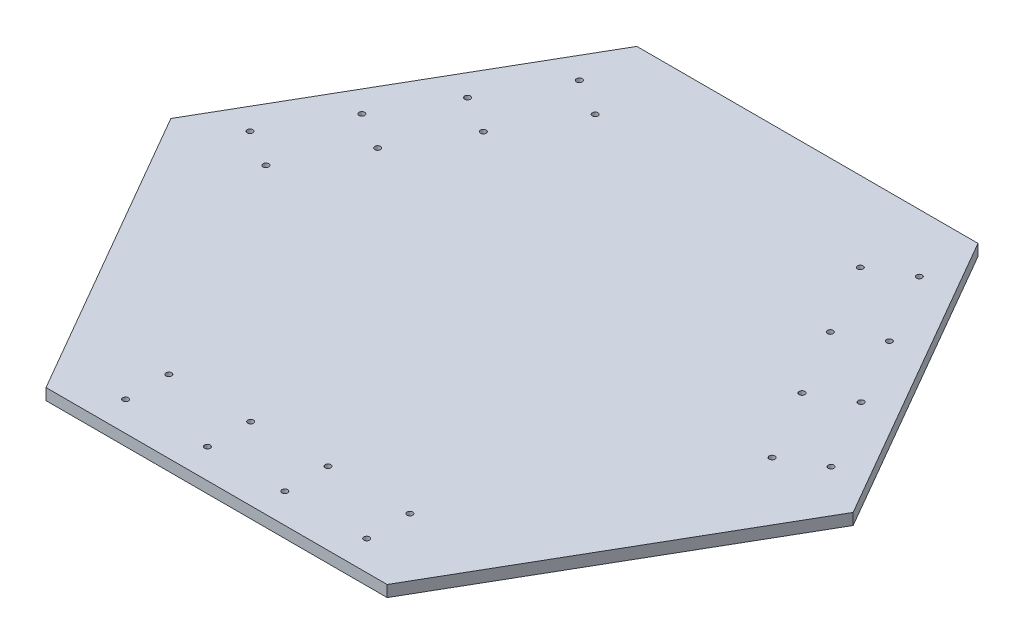
ISO-10303-21;
HEADER;
FILE_DESCRIPTION(('STEP AP214'),'2;1');
FILE_NAME('part.step','',(''),(''),'','','');
FILE_SCHEMA(('AUTOMOTIVE_DESIGN { 1 0 10303 214 1 1 1 1 }'));
ENDSEC;
DATA;
#1=APPLICATION_CONTEXT('core data for automotive mechanical design processes');
#2=APPLICATION_PROTOCOL_DEFINITION('international standard','automotive_design',2000,#1);
#3=PRODUCT_CONTEXT('',#1,'mechanical');
#4=PRODUCT('Part','Part','',(#3));
#5=PRODUCT_RELATED_PRODUCT_CATEGORY('part','',(#4));
#6=PRODUCT_DEFINITION_FORMATION('','',#4);
#7=PRODUCT_DEFINITION_CONTEXT('part definition',#1,'design');
#8=PRODUCT_DEFINITION('design','',#6,#7);
#9=PRODUCT_DEFINITION_SHAPE('','',#8);
#10=(LENGTH_UNIT() NAMED_UNIT(*) SI_UNIT(.MILLI.,.METRE.));
#11=(NAMED_UNIT(*) PLANE_ANGLE_UNIT() SI_UNIT($,.RADIAN.));
#12=(NAMED_UNIT(*) SI_UNIT($,.STERADIAN.) SOLID_ANGLE_UNIT());
#13=UNCERTAINTY_MEASURE_WITH_UNIT(LENGTH_MEASURE(1.E-05),#10,'distance_accuracy_value','');
#14=(GEOMETRIC_REPRESENTATION_CONTEXT(3) GLOBAL_UNCERTAINTY_ASSIGNED_CONTEXT((#13)) GLOBAL_UNIT_ASSIGNED_CONTEXT((#10,
#11,#12)) REPRESENTATION_CONTEXT('',''));
#15=CARTESIAN_POINT('',(0.,0.,0.));
#16=DIRECTION('',(0.,0.,1.));
#17=DIRECTION('',(1.,0.,0.));
#18=AXIS2_PLACEMENT_3D('',#15,#16,#17);
#19=CARTESIAN_POINT('',(-75.,5.,-129.903810567666));
#20=DIRECTION('',(0.866025403784439,0.,0.5));
#21=DIRECTION('',(0.5,0.,-0.866025403784439));
#22=AXIS2_PLACEMENT_3D('',#19,#20,#21);
#23=PLANE('',#22);
#24=DIRECTION('',(-0.5,0.,0.866025403784439));
#25=VECTOR('',#24,1.);
#26=CARTESIAN_POINT('',(-75.,0.,-129.903810567666));
#27=LINE('',#26,#25);
#28=CARTESIAN_POINT('',(-75.,0.,-129.903810567666));
#29=VERTEX_POINT('',#28);
#30=CARTESIAN_POINT('',(-150.,0.,0.));
#31=VERTEX_POINT('',#30);
#32=EDGE_CURVE('E127',#29,#31,#27,.T.);
#33=ORIENTED_EDGE('',*,*,#32,.T.);
#34=DIRECTION('',(0.,-1.,0.));
#35=VECTOR('',#34,1.);
#36=CARTESIAN_POINT('',(-150.,5.,0.));
#37=LINE('',#36,#35);
#38=CARTESIAN_POINT('',(-150.,5.,0.));
#39=VERTEX_POINT('',#38);
#40=EDGE_CURVE('E11',#39,#31,#37,.T.);
#41=ORIENTED_EDGE('',*,*,#40,.F.);
#42=DIRECTION('',(-0.5,0.,0.866025403784439));
#43=VECTOR('',#42,1.);
#44=CARTESIAN_POINT('',(-75.,5.,-129.903810567666));
#45=LINE('',#44,#43);
#46=CARTESIAN_POINT('',(-75.,5.,-129.903810567666));
#47=VERTEX_POINT('',#46);
#48=EDGE_CURVE('E138',#47,#39,#45,.T.);
#49=ORIENTED_EDGE('',*,*,#48,.F.);
#50=DIRECTION('',(0.,-1.,0.));
#51=VECTOR('',#50,1.);
#52=CARTESIAN_POINT('',(-75.,5.,-129.903810567666));
#53=LINE('',#52,#51);
#54=EDGE_CURVE('E123',#47,#29,#53,.T.);
#55=ORIENTED_EDGE('',*,*,#54,.T.);
#56=EDGE_LOOP('',(#33,#41,#49,#55));
#57=FACE_BOUND('',#56,.T.);
#58=ADVANCED_FACE('F43',(#57),#23,.F.);
#59=CARTESIAN_POINT('',(-150.,5.,0.));
#60=DIRECTION('',(0.866025403784439,0.,-0.5));
#61=DIRECTION('',(-0.5,0.,-0.866025403784439));
#62=AXIS2_PLACEMENT_3D('',#59,#60,#61);
#63=PLANE('',#62);
#64=DIRECTION('',(0.5,0.,0.866025403784438));
#65=VECTOR('',#64,1.);
#66=CARTESIAN_POINT('',(-150.,0.,0.));
#67=LINE('',#66,#65);
#68=CARTESIAN_POINT('',(-74.9999999999999,0.,129.903810567666));
#69=VERTEX_POINT('',#68);
#70=EDGE_CURVE('E130',#31,#69,#67,.T.);
#71=ORIENTED_EDGE('',*,*,#70,.T.);
#72=DIRECTION('',(0.,-1.,0.));
#73=VECTOR('',#72,1.);
#74=CARTESIAN_POINT('',(-74.9999999999999,5.,129.903810567666));
#75=LINE('',#74,#73);
#76=CARTESIAN_POINT('',(-74.9999999999999,5.,129.903810567666));
#77=VERTEX_POINT('',#76);
#78=EDGE_CURVE('E51',#77,#69,#75,.T.);
#79=ORIENTED_EDGE('',*,*,#78,.F.);
#80=DIRECTION('',(0.5,0.,0.866025403784438));
#81=VECTOR('',#80,1.);
#82=CARTESIAN_POINT('',(-150.,5.,0.));
#83=LINE('',#82,#81);
#84=EDGE_CURVE('E96',#39,#77,#83,.T.);
#85=ORIENTED_EDGE('',*,*,#84,.F.);
#86=ORIENTED_EDGE('',*,*,#40,.T.);
#87=EDGE_LOOP('',(#71,#79,#85,#86));
#88=FACE_BOUND('',#87,.T.);
#89=ADVANCED_FACE('F163',(#88),#63,.F.);
#90=CARTESIAN_POINT('',(-74.9999999999999,5.,129.903810567666));
#91=DIRECTION('',(0.,0.,-1.));
#92=DIRECTION('',(-1.,0.,0.));
#93=AXIS2_PLACEMENT_3D('',#90,#91,#92);
#94=PLANE('',#93);
#95=DIRECTION('',(1.,0.,0.));
#96=VECTOR('',#95,1.);
#97=CARTESIAN_POINT('',(-74.9999999999999,0.,129.903810567666));
#98=LINE('',#97,#96);
#99=CARTESIAN_POINT('',(75.,0.,129.903810567666));
#100=VERTEX_POINT('',#99);
#101=EDGE_CURVE('E133',#69,#100,#98,.T.);
#102=ORIENTED_EDGE('',*,*,#101,.T.);
#103=DIRECTION('',(0.,-1.,0.));
#104=VECTOR('',#103,1.);
#105=CARTESIAN_POINT('',(75.,5.,129.903810567666));
#106=LINE('',#105,#104);
#107=CARTESIAN_POINT('',(75.,5.,129.903810567666));
#108=VERTEX_POINT('',#107);
#109=EDGE_CURVE('E118',#108,#100,#106,.T.);
#110=ORIENTED_EDGE('',*,*,#109,.F.);
#111=DIRECTION('',(1.,0.,0.));
#112=VECTOR('',#111,1.);
#113=CARTESIAN_POINT('',(-74.9999999999999,5.,129.903810567666));
#114=LINE('',#113,#112);
#115=EDGE_CURVE('E109',#77,#108,#114,.T.);
#116=ORIENTED_EDGE('',*,*,#115,.F.);
#117=ORIENTED_EDGE('',*,*,#78,.T.);
#118=EDGE_LOOP('',(#102,#110,#116,#117));
#119=FACE_BOUND('',#118,.T.);
#120=ADVANCED_FACE('F144',(#119),#94,.F.);
#121=CARTESIAN_POINT('',(75.,5.,129.903810567666));
#122=DIRECTION('',(-0.866025403784439,0.,-0.5));
#123=DIRECTION('',(-0.5,0.,0.866025403784439));
#124=AXIS2_PLACEMENT_3D('',#121,#122,#123);
#125=PLANE('',#124);
#126=DIRECTION('',(0.5,0.,-0.866025403784439));
#127=VECTOR('',#126,1.);
#128=CARTESIAN_POINT('',(75.,0.,129.903810567666));
#129=LINE('',#128,#127);
#130=CARTESIAN_POINT('',(150.,0.,0.));
#131=VERTEX_POINT('',#130);
#132=EDGE_CURVE('E117',#100,#131,#129,.T.);
#133=ORIENTED_EDGE('',*,*,#132,.T.);
#134=DIRECTION('',(0.,-1.,0.));
#135=VECTOR('',#134,1.);
#136=CARTESIAN_POINT('',(150.,5.,0.));
#137=LINE('',#136,#135);
#138=CARTESIAN_POINT('',(150.,5.,0.));
#139=VERTEX_POINT('',#138);
#140=EDGE_CURVE('E114',#139,#131,#137,.T.);
#141=ORIENTED_EDGE('',*,*,#140,.F.);
#142=DIRECTION('',(0.5,0.,-0.866025403784439));
#143=VECTOR('',#142,1.);
#144=CARTESIAN_POINT('',(75.,5.,129.903810567666));
#145=LINE('',#144,#143);
#146=EDGE_CURVE('E103',#108,#139,#145,.T.);
#147=ORIENTED_EDGE('',*,*,#146,.F.);
#148=ORIENTED_EDGE('',*,*,#109,.T.);
#149=EDGE_LOOP('',(#133,#141,#147,#148));
#150=FACE_BOUND('',#149,.T.);
#151=ADVANCED_FACE('F115',(#150),#125,.F.);
#152=CARTESIAN_POINT('',(150.,5.,0.));
#153=DIRECTION('',(-0.866025403784439,0.,0.5));
#154=DIRECTION('',(0.5,0.,0.866025403784439));
#155=AXIS2_PLACEMENT_3D('',#152,#153,#154);
#156=PLANE('',#155);
#157=DIRECTION('',(-0.5,0.,-0.866025403784439));
#158=VECTOR('',#157,1.);
#159=CARTESIAN_POINT('',(150.,0.,0.));
#160=LINE('',#159,#158);
#161=CARTESIAN_POINT('',(75.,0.,-129.903810567666));
#162=VERTEX_POINT('',#161);
#163=EDGE_CURVE('E82',#131,#162,#160,.T.);
#164=ORIENTED_EDGE('',*,*,#163,.T.);
#165=DIRECTION('',(0.,-1.,0.));
#166=VECTOR('',#165,1.);
#167=CARTESIAN_POINT('',(75.,5.,-129.903810567666));
#168=LINE('',#167,#166);
#169=CARTESIAN_POINT('',(75.,5.,-129.903810567666));
#170=VERTEX_POINT('',#169);
#171=EDGE_CURVE('E119',#170,#162,#168,.T.);
#172=ORIENTED_EDGE('',*,*,#171,.F.);
#173=DIRECTION('',(-0.5,0.,-0.866025403784439));
#174=VECTOR('',#173,1.);
#175=CARTESIAN_POINT('',(150.,5.,0.));
#176=LINE('',#175,#174);
#177=EDGE_CURVE('E107',#139,#170,#176,.T.);
#178=ORIENTED_EDGE('',*,*,#177,.F.);
#179=ORIENTED_EDGE('',*,*,#140,.T.);
#180=EDGE_LOOP('',(#164,#172,#178,#179));
#181=FACE_BOUND('',#180,.T.);
#182=ADVANCED_FACE('F121',(#181),#156,.F.);
#183=CARTESIAN_POINT('',(75.,5.,-129.903810567666));
#184=DIRECTION('',(0.,0.,1.));
#185=DIRECTION('',(1.,0.,0.));
#186=AXIS2_PLACEMENT_3D('',#183,#184,#185);
#187=PLANE('',#186);
#188=DIRECTION('',(-1.,0.,0.));
#189=VECTOR('',#188,1.);
#190=CARTESIAN_POINT('',(75.,0.,-129.903810567666));
#191=LINE('',#190,#189);
#192=EDGE_CURVE('E88',#162,#29,#191,.T.);
#193=ORIENTED_EDGE('',*,*,#192,.T.);
#194=ORIENTED_EDGE('',*,*,#54,.F.);
#195=DIRECTION('',(-1.,0.,0.));
#196=VECTOR('',#195,1.);
#197=CARTESIAN_POINT('',(75.,5.,-129.903810567666));
#198=LINE('',#197,#196);
#199=EDGE_CURVE('E59',#170,#47,#198,.T.);
#200=ORIENTED_EDGE('',*,*,#199,.F.);
#201=ORIENTED_EDGE('',*,*,#171,.T.);
#202=EDGE_LOOP('',(#193,#194,#200,#201));
#203=FACE_BOUND('',#202,.T.);
#204=ADVANCED_FACE('F151',(#203),#187,.F.);
#205=CARTESIAN_POINT('',(0.,5.,0.));
#206=DIRECTION('',(0.,1.,0.));
#207=DIRECTION('',(0.,0.,1.));
#208=AXIS2_PLACEMENT_3D('',#205,#206,#207);
#209=PLANE('',#208);
#210=CARTESIAN_POINT('',(58.2871870788989,5.,-94.8512516844076));
#211=DIRECTION('',(0.,1.,0.));
#212=DIRECTION('',(0.,0.,1.));
#213=AXIS2_PLACEMENT_3D('',#210,#211,#212);
#214=CIRCLE('',#213,1.24999999999999);
#215=CARTESIAN_POINT('',(58.2871870788989,5.,-93.6012516844076));
#216=VERTEX_POINT('',#215);
#217=EDGE_CURVE('E723',#216,#216,#214,.T.);
#218=ORIENTED_EDGE('',*,*,#217,.F.);
#219=EDGE_LOOP('',(#218));
#220=FACE_BOUND('',#219,.T.);
#221=CARTESIAN_POINT('',(76.2871870788986,5.,-63.6743371481676));
#222=DIRECTION('',(0.,1.,0.));
#223=DIRECTION('',(0.,0.,1.));
#224=AXIS2_PLACEMENT_3D('',#221,#222,#223);
#225=CIRCLE('',#224,1.24999999999999);
#226=CARTESIAN_POINT('',(76.2871870788986,5.,-62.4243371481676));
#227=VERTEX_POINT('',#226);
#228=EDGE_CURVE('E725',#227,#227,#225,.T.);
#229=ORIENTED_EDGE('',*,*,#228,.F.);
#230=EDGE_LOOP('',(#229));
#231=FACE_BOUND('',#230,.T.);
#232=CARTESIAN_POINT('',(92.741669750803,5.,-73.1743371481675));
#233=DIRECTION('',(0.,1.,0.));
#234=DIRECTION('',(0.,0.,1.));
#235=AXIS2_PLACEMENT_3D('',#232,#233,#234);
#236=CIRCLE('',#235,1.24999999999999);
#237=CARTESIAN_POINT('',(92.741669750803,5.,-71.9243371481675));
#238=VERTEX_POINT('',#237);
#239=EDGE_CURVE('E733',#238,#238,#236,.T.);
#240=ORIENTED_EDGE('',*,*,#239,.F.);
#241=EDGE_LOOP('',(#240));
#242=FACE_BOUND('',#241,.T.);
#243=CARTESIAN_POINT('',(74.7416697508033,5.,-104.351251684407));
#244=DIRECTION('',(0.,1.,0.));
#245=DIRECTION('',(0.,0.,1.));
#246=AXIS2_PLACEMENT_3D('',#243,#244,#245);
#247=CIRCLE('',#246,1.24999999999999);
#248=CARTESIAN_POINT('',(74.7416697508033,5.,-103.101251684407));
#249=VERTEX_POINT('',#248);
#250=EDGE_CURVE('E739',#249,#249,#247,.T.);
#251=ORIENTED_EDGE('',*,*,#250,.F.);
#252=EDGE_LOOP('',(#251));
#253=FACE_BOUND('',#252,.T.);
#254=CARTESIAN_POINT('',(-111.287187078898,5.,-3.05255888325824));
#255=DIRECTION('',(0.,1.,0.));
#256=DIRECTION('',(0.,0.,1.));
#257=AXIS2_PLACEMENT_3D('',#254,#255,#256);
#258=CIRCLE('',#257,1.24999999999999);
#259=CARTESIAN_POINT('',(-111.287187078898,5.,-1.80255888325825));
#260=VERTEX_POINT('',#259);
#261=EDGE_CURVE('E745',#260,#260,#258,.T.);
#262=ORIENTED_EDGE('',*,*,#261,.F.);
#263=EDGE_LOOP('',(#262));
#264=FACE_BOUND('',#263,.T.);
#265=CARTESIAN_POINT('',(-93.2871870788978,5.,-34.229473419498));
#266=DIRECTION('',(0.,1.,0.));
#267=DIRECTION('',(0.,0.,1.));
#268=AXIS2_PLACEMENT_3D('',#265,#266,#267);
#269=CIRCLE('',#268,1.24999999999999);
#270=CARTESIAN_POINT('',(-93.2871870788978,5.,-32.979473419498));
#271=VERTEX_POINT('',#270);
#272=EDGE_CURVE('E751',#271,#271,#269,.T.);
#273=ORIENTED_EDGE('',*,*,#272,.F.);
#274=EDGE_LOOP('',(#273));
#275=FACE_BOUND('',#274,.T.);
#276=CARTESIAN_POINT('',(-109.741669750802,5.,-43.729473419498));
#277=DIRECTION('',(0.,1.,0.));
#278=DIRECTION('',(0.,0.,1.));
#279=AXIS2_PLACEMENT_3D('',#276,#277,#278);
#280=CIRCLE('',#279,1.24999999999999);
#281=CARTESIAN_POINT('',(-109.741669750802,5.,-42.479473419498));
#282=VERTEX_POINT('',#281);
#283=EDGE_CURVE('E757',#282,#282,#280,.T.);
#284=ORIENTED_EDGE('',*,*,#283,.F.);
#285=EDGE_LOOP('',(#284));
#286=FACE_BOUND('',#285,.T.);
#287=CARTESIAN_POINT('',(-127.741669750802,5.,-12.5525588832583));
#288=DIRECTION('',(0.,1.,0.));
#289=DIRECTION('',(0.,0.,1.));
#290=AXIS2_PLACEMENT_3D('',#287,#288,#289);
#291=CIRCLE('',#290,1.24999999999997);
#292=CARTESIAN_POINT('',(-127.741669750802,5.,-11.3025588832584));
#293=VERTEX_POINT('',#292);
#294=EDGE_CURVE('E763',#293,#293,#291,.T.);
#295=ORIENTED_EDGE('',*,*,#294,.F.);
#296=EDGE_LOOP('',(#295));
#297=FACE_BOUND('',#296,.T.);
#298=CARTESIAN_POINT('',(111.287187078898,5.,-3.05255888325669));
#299=DIRECTION('',(0.,1.,0.));
#300=DIRECTION('',(0.,0.,1.));
#301=AXIS2_PLACEMENT_3D('',#298,#299,#300);
#302=CIRCLE('',#301,1.24999999999999);
#303=CARTESIAN_POINT('',(111.287187078898,5.,-1.80255888325671));
#304=VERTEX_POINT('',#303);
#305=EDGE_CURVE('E769',#304,#304,#302,.T.);
#306=ORIENTED_EDGE('',*,*,#305,.F.);
#307=EDGE_LOOP('',(#306));
#308=FACE_BOUND('',#307,.T.);
#309=CARTESIAN_POINT('',(93.2871870788983,5.,-34.2294734194966));
#310=DIRECTION('',(0.,1.,0.));
#311=DIRECTION('',(0.,0.,1.));
#312=AXIS2_PLACEMENT_3D('',#309,#310,#311);
#313=CIRCLE('',#312,1.24999999999999);
#314=CARTESIAN_POINT('',(93.2871870788983,5.,-32.9794734194967));
#315=VERTEX_POINT('',#314);
#316=EDGE_CURVE('E775',#315,#315,#313,.T.);
#317=ORIENTED_EDGE('',*,*,#316,.F.);
#318=EDGE_LOOP('',(#317));
#319=FACE_BOUND('',#318,.T.);
#320=CARTESIAN_POINT('',(109.741669750803,5.,-43.7294734194965));
#321=DIRECTION('',(0.,1.,0.));
#322=DIRECTION('',(0.,0.,1.));
#323=AXIS2_PLACEMENT_3D('',#320,#321,#322);
#324=CIRCLE('',#323,1.24999999999999);
#325=CARTESIAN_POINT('',(109.741669750803,5.,-42.4794734194965));
#326=VERTEX_POINT('',#325);
#327=EDGE_CURVE('E781',#326,#326,#324,.T.);
#328=ORIENTED_EDGE('',*,*,#327,.F.);
#329=EDGE_LOOP('',(#328));
#330=FACE_BOUND('',#329,.T.);
#331=CARTESIAN_POINT('',(127.741669750802,5.,-12.5525588832565));
#332=DIRECTION('',(0.,1.,0.));
#333=DIRECTION('',(0.,0.,1.));
#334=AXIS2_PLACEMENT_3D('',#331,#332,#333);
#335=CIRCLE('',#334,1.24999999999997);
#336=CARTESIAN_POINT('',(127.741669750802,5.,-11.3025588832566));
#337=VERTEX_POINT('',#336);
#338=EDGE_CURVE('E787',#337,#337,#335,.T.);
#339=ORIENTED_EDGE('',*,*,#338,.F.);
#340=EDGE_LOOP('',(#339));
#341=FACE_BOUND('',#340,.T.);
#342=CARTESIAN_POINT('',(-58.2871870788976,5.,-94.8512516844084));
#343=DIRECTION('',(0.,1.,0.));
#344=DIRECTION('',(0.,0.,1.));
#345=AXIS2_PLACEMENT_3D('',#342,#343,#344);
#346=CIRCLE('',#345,1.24999999999999);
#347=CARTESIAN_POINT('',(-58.2871870788976,5.,-93.6012516844084));
#348=VERTEX_POINT('',#347);
#349=EDGE_CURVE('E793',#348,#348,#346,.T.);
#350=ORIENTED_EDGE('',*,*,#349,.F.);
#351=EDGE_LOOP('',(#350));
#352=FACE_BOUND('',#351,.T.);
#353=CARTESIAN_POINT('',(-76.2871870788978,5.,-63.6743371481687));
#354=DIRECTION('',(0.,1.,0.));
#355=DIRECTION('',(0.,0.,1.));
#356=AXIS2_PLACEMENT_3D('',#353,#354,#355);
#357=CIRCLE('',#356,1.24999999999999);
#358=CARTESIAN_POINT('',(-76.2871870788978,5.,-62.4243371481687));
#359=VERTEX_POINT('',#358);
#360=EDGE_CURVE('E799',#359,#359,#357,.T.);
#361=ORIENTED_EDGE('',*,*,#360,.F.);
#362=EDGE_LOOP('',(#361));
#363=FACE_BOUND('',#362,.T.);
#364=CARTESIAN_POINT('',(-92.741669750802,5.,-73.1743371481688));
#365=DIRECTION('',(0.,1.,0.));
#366=DIRECTION('',(0.,0.,1.));
#367=AXIS2_PLACEMENT_3D('',#364,#365,#366);
#368=CIRCLE('',#367,1.24999999999999);
#369=CARTESIAN_POINT('',(-92.741669750802,5.,-71.9243371481688));
#370=VERTEX_POINT('',#369);
#371=EDGE_CURVE('E805',#370,#370,#368,.T.);
#372=ORIENTED_EDGE('',*,*,#371,.F.);
#373=EDGE_LOOP('',(#372));
#374=FACE_BOUND('',#373,.T.);
#375=CARTESIAN_POINT('',(-74.7416697508019,5.,-104.351251684408));
#376=DIRECTION('',(0.,1.,0.));
#377=DIRECTION('',(0.,0.,1.));
#378=AXIS2_PLACEMENT_3D('',#375,#376,#377);
#379=CIRCLE('',#378,1.24999999999999);
#380=CARTESIAN_POINT('',(-74.7416697508019,5.,-103.101251684408));
#381=VERTEX_POINT('',#380);
#382=EDGE_CURVE('E811',#381,#381,#379,.T.);
#383=ORIENTED_EDGE('',*,*,#382,.F.);
#384=EDGE_LOOP('',(#383));
#385=FACE_BOUND('',#384,.T.);
#386=CARTESIAN_POINT('',(52.9999999999999,5.,97.9038105676658));
#387=DIRECTION('',(0.,1.,0.));
#388=DIRECTION('',(0.,0.,1.));
#389=AXIS2_PLACEMENT_3D('',#386,#387,#388);
#390=CIRCLE('',#389,1.24999999999999);
#391=CARTESIAN_POINT('',(52.9999999999999,5.,99.1538105676658));
#392=VERTEX_POINT('',#391);
#393=EDGE_CURVE('E817',#392,#392,#390,.T.);
#394=ORIENTED_EDGE('',*,*,#393,.F.);
#395=EDGE_LOOP('',(#394));
#396=FACE_BOUND('',#395,.T.);
#397=CARTESIAN_POINT('',(16.9999999999999,5.,97.9038105676658));
#398=DIRECTION('',(0.,1.,0.));
#399=DIRECTION('',(0.,0.,1.));
#400=AXIS2_PLACEMENT_3D('',#397,#398,#399);
#401=CIRCLE('',#400,1.24999999999999);
#402=CARTESIAN_POINT('',(16.9999999999999,5.,99.1538105676658));
#403=VERTEX_POINT('',#402);
#404=EDGE_CURVE('E823',#403,#403,#401,.T.);
#405=ORIENTED_EDGE('',*,*,#404,.F.);
#406=EDGE_LOOP('',(#405));
#407=FACE_BOUND('',#406,.T.);
#408=CARTESIAN_POINT('',(16.9999999999999,5.,116.903810567666));
#409=DIRECTION('',(0.,1.,0.));
#410=DIRECTION('',(0.,0.,1.));
#411=AXIS2_PLACEMENT_3D('',#408,#409,#410);
#412=CIRCLE('',#411,1.24999999999999);
#413=CARTESIAN_POINT('',(16.9999999999999,5.,118.153810567666));
#414=VERTEX_POINT('',#413);
#415=EDGE_CURVE('E829',#414,#414,#412,.T.);
#416=ORIENTED_EDGE('',*,*,#415,.F.);
#417=EDGE_LOOP('',(#416));
#418=FACE_BOUND('',#417,.T.);
#419=CARTESIAN_POINT('',(52.9999999999999,5.,116.903810567666));
#420=DIRECTION('',(0.,1.,0.));
#421=DIRECTION('',(0.,0.,1.));
#422=AXIS2_PLACEMENT_3D('',#419,#420,#421);
#423=CIRCLE('',#422,1.24999999999999);
#424=CARTESIAN_POINT('',(52.9999999999999,5.,118.153810567666));
#425=VERTEX_POINT('',#424);
#426=EDGE_CURVE('E835',#425,#425,#423,.T.);
#427=ORIENTED_EDGE('',*,*,#426,.F.);
#428=EDGE_LOOP('',(#427));
#429=FACE_BOUND('',#428,.T.);
#430=CARTESIAN_POINT('',(-52.9999999999999,5.,97.9038105676658));
#431=DIRECTION('',(0.,1.,0.));
#432=DIRECTION('',(0.,0.,1.));
#433=AXIS2_PLACEMENT_3D('',#430,#431,#432);
#434=CIRCLE('',#433,1.24999999999999);
#435=CARTESIAN_POINT('',(-52.9999999999999,5.,99.1538105676658));
#436=VERTEX_POINT('',#435);
#437=EDGE_CURVE('E841',#436,#436,#434,.T.);
#438=ORIENTED_EDGE('',*,*,#437,.F.);
#439=EDGE_LOOP('',(#438));
#440=FACE_BOUND('',#439,.T.);
#441=CARTESIAN_POINT('',(-16.9999999999999,5.,97.9038105676658));
#442=DIRECTION('',(0.,1.,0.));
#443=DIRECTION('',(0.,0.,1.));
#444=AXIS2_PLACEMENT_3D('',#441,#442,#443);
#445=CIRCLE('',#444,1.24999999999999);
#446=CARTESIAN_POINT('',(-16.9999999999999,5.,99.1538105676658));
#447=VERTEX_POINT('',#446);
#448=EDGE_CURVE('E847',#447,#447,#445,.T.);
#449=ORIENTED_EDGE('',*,*,#448,.F.);
#450=EDGE_LOOP('',(#449));
#451=FACE_BOUND('',#450,.T.);
#452=CARTESIAN_POINT('',(-16.9999999999999,5.,116.903810567666));
#453=DIRECTION('',(0.,1.,0.));
#454=DIRECTION('',(0.,0.,1.));
#455=AXIS2_PLACEMENT_3D('',#452,#453,#454);
#456=CIRCLE('',#455,1.24999999999999);
#457=CARTESIAN_POINT('',(-16.9999999999999,5.,118.153810567666));
#458=VERTEX_POINT('',#457);
#459=EDGE_CURVE('E853',#458,#458,#456,.T.);
#460=ORIENTED_EDGE('',*,*,#459,.F.);
#461=EDGE_LOOP('',(#460));
#462=FACE_BOUND('',#461,.T.);
#463=CARTESIAN_POINT('',(-52.9999999999999,5.,116.903810567666));
#464=DIRECTION('',(0.,1.,0.));
#465=DIRECTION('',(0.,0.,1.));
#466=AXIS2_PLACEMENT_3D('',#463,#464,#465);
#467=CIRCLE('',#466,1.24999999999999);
#468=CARTESIAN_POINT('',(-52.9999999999999,5.,118.153810567666));
#469=VERTEX_POINT('',#468);
#470=EDGE_CURVE('E859',#469,#469,#467,.T.);
#471=ORIENTED_EDGE('',*,*,#470,.F.);
#472=EDGE_LOOP('',(#471));
#473=FACE_BOUND('',#472,.T.);
#474=ORIENTED_EDGE('',*,*,#48,.T.);
#475=ORIENTED_EDGE('',*,*,#84,.T.);
#476=ORIENTED_EDGE('',*,*,#115,.T.);
#477=ORIENTED_EDGE('',*,*,#146,.T.);
#478=ORIENTED_EDGE('',*,*,#177,.T.);
#479=ORIENTED_EDGE('',*,*,#199,.T.);
#480=EDGE_LOOP('',(#474,#475,#476,#477,#478,#479));
#481=FACE_BOUND('',#480,.T.);
#482=ADVANCED_FACE('F105',(#220,#231,#242,#253,#264,#275,#286,#297,#308,#319,#330,#341,#352,
#363,#374,#385,#396,#407,#418,#429,#440,#451,#462,#473,#481),#209,.T.);
#483=CARTESIAN_POINT('',(0.,0.,0.));
#484=DIRECTION('',(0.,1.,0.));
#485=DIRECTION('',(0.,0.,1.));
#486=AXIS2_PLACEMENT_3D('',#483,#484,#485);
#487=PLANE('',#486);
#488=CARTESIAN_POINT('',(58.2871870788989,0.,-94.8512516844076));
#489=DIRECTION('',(0.,1.,0.));
#490=DIRECTION('',(0.,0.,1.));
#491=AXIS2_PLACEMENT_3D('',#488,#489,#490);
#492=CIRCLE('',#491,1.25);
#493=CARTESIAN_POINT('',(58.2871870788989,0.,-93.6012516844076));
#494=VERTEX_POINT('',#493);
#495=EDGE_CURVE('E720',#494,#494,#492,.T.);
#496=ORIENTED_EDGE('',*,*,#495,.T.);
#497=EDGE_LOOP('',(#496));
#498=FACE_BOUND('',#497,.T.);
#499=CARTESIAN_POINT('',(76.2871870788986,0.,-63.6743371481676));
#500=DIRECTION('',(0.,1.,0.));
#501=DIRECTION('',(0.,0.,1.));
#502=AXIS2_PLACEMENT_3D('',#499,#500,#501);
#503=CIRCLE('',#502,1.25);
#504=CARTESIAN_POINT('',(76.2871870788986,0.,-62.4243371481676));
#505=VERTEX_POINT('',#504);
#506=EDGE_CURVE('E730',#505,#505,#503,.T.);
#507=ORIENTED_EDGE('',*,*,#506,.T.);
#508=EDGE_LOOP('',(#507));
#509=FACE_BOUND('',#508,.T.);
#510=CARTESIAN_POINT('',(92.741669750803,0.,-73.1743371481675));
#511=DIRECTION('',(0.,1.,0.));
#512=DIRECTION('',(0.,0.,1.));
#513=AXIS2_PLACEMENT_3D('',#510,#511,#512);
#514=CIRCLE('',#513,1.25);
#515=CARTESIAN_POINT('',(92.741669750803,0.,-71.9243371481675));
#516=VERTEX_POINT('',#515);
#517=EDGE_CURVE('E736',#516,#516,#514,.T.);
#518=ORIENTED_EDGE('',*,*,#517,.T.);
#519=EDGE_LOOP('',(#518));
#520=FACE_BOUND('',#519,.T.);
#521=CARTESIAN_POINT('',(74.7416697508033,0.,-104.351251684407));
#522=DIRECTION('',(0.,1.,0.));
#523=DIRECTION('',(0.,0.,1.));
#524=AXIS2_PLACEMENT_3D('',#521,#522,#523);
#525=CIRCLE('',#524,1.25);
#526=CARTESIAN_POINT('',(74.7416697508033,0.,-103.101251684407));
#527=VERTEX_POINT('',#526);
#528=EDGE_CURVE('E742',#527,#527,#525,.T.);
#529=ORIENTED_EDGE('',*,*,#528,.T.);
#530=EDGE_LOOP('',(#529));
#531=FACE_BOUND('',#530,.T.);
#532=CARTESIAN_POINT('',(-111.287187078898,0.,-3.05255888325824));
#533=DIRECTION('',(0.,1.,0.));
#534=DIRECTION('',(0.,0.,1.));
#535=AXIS2_PLACEMENT_3D('',#532,#533,#534);
#536=CIRCLE('',#535,1.25);
#537=CARTESIAN_POINT('',(-111.287187078898,0.,-1.80255888325824));
#538=VERTEX_POINT('',#537);
#539=EDGE_CURVE('E748',#538,#538,#536,.T.);
#540=ORIENTED_EDGE('',*,*,#539,.T.);
#541=EDGE_LOOP('',(#540));
#542=FACE_BOUND('',#541,.T.);
#543=CARTESIAN_POINT('',(-93.2871870788978,0.,-34.229473419498));
#544=DIRECTION('',(0.,1.,0.));
#545=DIRECTION('',(0.,0.,1.));
#546=AXIS2_PLACEMENT_3D('',#543,#544,#545);
#547=CIRCLE('',#546,1.25);
#548=CARTESIAN_POINT('',(-93.2871870788978,0.,-32.979473419498));
#549=VERTEX_POINT('',#548);
#550=EDGE_CURVE('E754',#549,#549,#547,.T.);
#551=ORIENTED_EDGE('',*,*,#550,.T.);
#552=EDGE_LOOP('',(#551));
#553=FACE_BOUND('',#552,.T.);
#554=CARTESIAN_POINT('',(-109.741669750802,0.,-43.729473419498));
#555=DIRECTION('',(0.,1.,0.));
#556=DIRECTION('',(0.,0.,1.));
#557=AXIS2_PLACEMENT_3D('',#554,#555,#556);
#558=CIRCLE('',#557,1.25);
#559=CARTESIAN_POINT('',(-109.741669750802,0.,-42.479473419498));
#560=VERTEX_POINT('',#559);
#561=EDGE_CURVE('E760',#560,#560,#558,.T.);
#562=ORIENTED_EDGE('',*,*,#561,.T.);
#563=EDGE_LOOP('',(#562));
#564=FACE_BOUND('',#563,.T.);
#565=CARTESIAN_POINT('',(-127.741669750802,0.,-12.5525588832583));
#566=DIRECTION('',(0.,1.,0.));
#567=DIRECTION('',(0.,0.,1.));
#568=AXIS2_PLACEMENT_3D('',#565,#566,#567);
#569=CIRCLE('',#568,1.25);
#570=CARTESIAN_POINT('',(-127.741669750802,0.,-11.3025588832583));
#571=VERTEX_POINT('',#570);
#572=EDGE_CURVE('E766',#571,#571,#569,.T.);
#573=ORIENTED_EDGE('',*,*,#572,.T.);
#574=EDGE_LOOP('',(#573));
#575=FACE_BOUND('',#574,.T.);
#576=CARTESIAN_POINT('',(111.287187078898,0.,-3.05255888325669));
#577=DIRECTION('',(0.,1.,0.));
#578=DIRECTION('',(0.,0.,1.));
#579=AXIS2_PLACEMENT_3D('',#576,#577,#578);
#580=CIRCLE('',#579,1.25);
#581=CARTESIAN_POINT('',(111.287187078898,0.,-1.80255888325669));
#582=VERTEX_POINT('',#581);
#583=EDGE_CURVE('E772',#582,#582,#580,.T.);
#584=ORIENTED_EDGE('',*,*,#583,.T.);
#585=EDGE_LOOP('',(#584));
#586=FACE_BOUND('',#585,.T.);
#587=CARTESIAN_POINT('',(93.2871870788983,0.,-34.2294734194966));
#588=DIRECTION('',(0.,1.,0.));
#589=DIRECTION('',(0.,0.,1.));
#590=AXIS2_PLACEMENT_3D('',#587,#588,#589);
#591=CIRCLE('',#590,1.25);
#592=CARTESIAN_POINT('',(93.2871870788983,0.,-32.9794734194966));
#593=VERTEX_POINT('',#592);
#594=EDGE_CURVE('E778',#593,#593,#591,.T.);
#595=ORIENTED_EDGE('',*,*,#594,.T.);
#596=EDGE_LOOP('',(#595));
#597=FACE_BOUND('',#596,.T.);
#598=CARTESIAN_POINT('',(109.741669750803,0.,-43.7294734194965));
#599=DIRECTION('',(0.,1.,0.));
#600=DIRECTION('',(0.,0.,1.));
#601=AXIS2_PLACEMENT_3D('',#598,#599,#600);
#602=CIRCLE('',#601,1.25);
#603=CARTESIAN_POINT('',(109.741669750803,0.,-42.4794734194965));
#604=VERTEX_POINT('',#603);
#605=EDGE_CURVE('E784',#604,#604,#602,.T.);
#606=ORIENTED_EDGE('',*,*,#605,.T.);
#607=EDGE_LOOP('',(#606));
#608=FACE_BOUND('',#607,.T.);
#609=CARTESIAN_POINT('',(127.741669750802,0.,-12.5525588832565));
#610=DIRECTION('',(0.,1.,0.));
#611=DIRECTION('',(0.,0.,1.));
#612=AXIS2_PLACEMENT_3D('',#609,#610,#611);
#613=CIRCLE('',#612,1.25);
#614=CARTESIAN_POINT('',(127.741669750802,0.,-11.3025588832565));
#615=VERTEX_POINT('',#614);
#616=EDGE_CURVE('E790',#615,#615,#613,.T.);
#617=ORIENTED_EDGE('',*,*,#616,.T.);
#618=EDGE_LOOP('',(#617));
#619=FACE_BOUND('',#618,.T.);
#620=CARTESIAN_POINT('',(-58.2871870788976,0.,-94.8512516844084));
#621=DIRECTION('',(0.,1.,0.));
#622=DIRECTION('',(0.,0.,1.));
#623=AXIS2_PLACEMENT_3D('',#620,#621,#622);
#624=CIRCLE('',#623,1.25);
#625=CARTESIAN_POINT('',(-58.2871870788976,0.,-93.6012516844084));
#626=VERTEX_POINT('',#625);
#627=EDGE_CURVE('E796',#626,#626,#624,.T.);
#628=ORIENTED_EDGE('',*,*,#627,.T.);
#629=EDGE_LOOP('',(#628));
#630=FACE_BOUND('',#629,.T.);
#631=CARTESIAN_POINT('',(-76.2871870788978,0.,-63.6743371481687));
#632=DIRECTION('',(0.,1.,0.));
#633=DIRECTION('',(0.,0.,1.));
#634=AXIS2_PLACEMENT_3D('',#631,#632,#633);
#635=CIRCLE('',#634,1.25);
#636=CARTESIAN_POINT('',(-76.2871870788978,0.,-62.4243371481687));
#637=VERTEX_POINT('',#636);
#638=EDGE_CURVE('E802',#637,#637,#635,.T.);
#639=ORIENTED_EDGE('',*,*,#638,.T.);
#640=EDGE_LOOP('',(#639));
#641=FACE_BOUND('',#640,.T.);
#642=CARTESIAN_POINT('',(-92.741669750802,0.,-73.1743371481688));
#643=DIRECTION('',(0.,1.,0.));
#644=DIRECTION('',(0.,0.,1.));
#645=AXIS2_PLACEMENT_3D('',#642,#643,#644);
#646=CIRCLE('',#645,1.25);
#647=CARTESIAN_POINT('',(-92.741669750802,0.,-71.9243371481688));
#648=VERTEX_POINT('',#647);
#649=EDGE_CURVE('E808',#648,#648,#646,.T.);
#650=ORIENTED_EDGE('',*,*,#649,.T.);
#651=EDGE_LOOP('',(#650));
#652=FACE_BOUND('',#651,.T.);
#653=CARTESIAN_POINT('',(-74.7416697508019,0.,-104.351251684408));
#654=DIRECTION('',(0.,1.,0.));
#655=DIRECTION('',(0.,0.,1.));
#656=AXIS2_PLACEMENT_3D('',#653,#654,#655);
#657=CIRCLE('',#656,1.25);
#658=CARTESIAN_POINT('',(-74.7416697508019,0.,-103.101251684408));
#659=VERTEX_POINT('',#658);
#660=EDGE_CURVE('E814',#659,#659,#657,.T.);
#661=ORIENTED_EDGE('',*,*,#660,.T.);
#662=EDGE_LOOP('',(#661));
#663=FACE_BOUND('',#662,.T.);
#664=CARTESIAN_POINT('',(52.9999999999999,0.,97.9038105676658));
#665=DIRECTION('',(0.,1.,0.));
#666=DIRECTION('',(0.,0.,1.));
#667=AXIS2_PLACEMENT_3D('',#664,#665,#666);
#668=CIRCLE('',#667,1.25);
#669=CARTESIAN_POINT('',(52.9999999999999,0.,99.1538105676658));
#670=VERTEX_POINT('',#669);
#671=EDGE_CURVE('E820',#670,#670,#668,.T.);
#672=ORIENTED_EDGE('',*,*,#671,.T.);
#673=EDGE_LOOP('',(#672));
#674=FACE_BOUND('',#673,.T.);
#675=CARTESIAN_POINT('',(16.9999999999999,0.,97.9038105676658));
#676=DIRECTION('',(0.,1.,0.));
#677=DIRECTION('',(0.,0.,1.));
#678=AXIS2_PLACEMENT_3D('',#675,#676,#677);
#679=CIRCLE('',#678,1.25);
#680=CARTESIAN_POINT('',(16.9999999999999,0.,99.1538105676658));
#681=VERTEX_POINT('',#680);
#682=EDGE_CURVE('E826',#681,#681,#679,.T.);
#683=ORIENTED_EDGE('',*,*,#682,.T.);
#684=EDGE_LOOP('',(#683));
#685=FACE_BOUND('',#684,.T.);
#686=CARTESIAN_POINT('',(16.9999999999999,0.,116.903810567666));
#687=DIRECTION('',(0.,1.,0.));
#688=DIRECTION('',(0.,0.,1.));
#689=AXIS2_PLACEMENT_3D('',#686,#687,#688);
#690=CIRCLE('',#689,1.25);
#691=CARTESIAN_POINT('',(16.9999999999999,0.,118.153810567666));
#692=VERTEX_POINT('',#691);
#693=EDGE_CURVE('E832',#692,#692,#690,.T.);
#694=ORIENTED_EDGE('',*,*,#693,.T.);
#695=EDGE_LOOP('',(#694));
#696=FACE_BOUND('',#695,.T.);
#697=CARTESIAN_POINT('',(52.9999999999999,0.,116.903810567666));
#698=DIRECTION('',(0.,1.,0.));
#699=DIRECTION('',(0.,0.,1.));
#700=AXIS2_PLACEMENT_3D('',#697,#698,#699);
#701=CIRCLE('',#700,1.25);
#702=CARTESIAN_POINT('',(52.9999999999999,0.,118.153810567666));
#703=VERTEX_POINT('',#702);
#704=EDGE_CURVE('E838',#703,#703,#701,.T.);
#705=ORIENTED_EDGE('',*,*,#704,.T.);
#706=EDGE_LOOP('',(#705));
#707=FACE_BOUND('',#706,.T.);
#708=CARTESIAN_POINT('',(-52.9999999999999,0.,97.9038105676658));
#709=DIRECTION('',(0.,1.,0.));
#710=DIRECTION('',(0.,0.,1.));
#711=AXIS2_PLACEMENT_3D('',#708,#709,#710);
#712=CIRCLE('',#711,1.25);
#713=CARTESIAN_POINT('',(-52.9999999999999,0.,99.1538105676658));
#714=VERTEX_POINT('',#713);
#715=EDGE_CURVE('E844',#714,#714,#712,.T.);
#716=ORIENTED_EDGE('',*,*,#715,.T.);
#717=EDGE_LOOP('',(#716));
#718=FACE_BOUND('',#717,.T.);
#719=CARTESIAN_POINT('',(-16.9999999999999,0.,97.9038105676658));
#720=DIRECTION('',(0.,1.,0.));
#721=DIRECTION('',(0.,0.,1.));
#722=AXIS2_PLACEMENT_3D('',#719,#720,#721);
#723=CIRCLE('',#722,1.25);
#724=CARTESIAN_POINT('',(-16.9999999999999,0.,99.1538105676658));
#725=VERTEX_POINT('',#724);
#726=EDGE_CURVE('E850',#725,#725,#723,.T.);
#727=ORIENTED_EDGE('',*,*,#726,.T.);
#728=EDGE_LOOP('',(#727));
#729=FACE_BOUND('',#728,.T.);
#730=CARTESIAN_POINT('',(-16.9999999999999,0.,116.903810567666));
#731=DIRECTION('',(0.,1.,0.));
#732=DIRECTION('',(0.,0.,1.));
#733=AXIS2_PLACEMENT_3D('',#730,#731,#732);
#734=CIRCLE('',#733,1.25);
#735=CARTESIAN_POINT('',(-16.9999999999999,0.,118.153810567666));
#736=VERTEX_POINT('',#735);
#737=EDGE_CURVE('E856',#736,#736,#734,.T.);
#738=ORIENTED_EDGE('',*,*,#737,.T.);
#739=EDGE_LOOP('',(#738));
#740=FACE_BOUND('',#739,.T.);
#741=CARTESIAN_POINT('',(-52.9999999999999,0.,116.903810567666));
#742=DIRECTION('',(0.,1.,0.));
#743=DIRECTION('',(0.,0.,1.));
#744=AXIS2_PLACEMENT_3D('',#741,#742,#743);
#745=CIRCLE('',#744,1.25);
#746=CARTESIAN_POINT('',(-52.9999999999999,0.,118.153810567666));
#747=VERTEX_POINT('',#746);
#748=EDGE_CURVE('E131',#747,#747,#745,.T.);
#749=ORIENTED_EDGE('',*,*,#748,.T.);
#750=EDGE_LOOP('',(#749));
#751=FACE_BOUND('',#750,.T.);
#752=ORIENTED_EDGE('',*,*,#32,.F.);
#753=ORIENTED_EDGE('',*,*,#192,.F.);
#754=ORIENTED_EDGE('',*,*,#163,.F.);
#755=ORIENTED_EDGE('',*,*,#132,.F.);
#756=ORIENTED_EDGE('',*,*,#101,.F.);
#757=ORIENTED_EDGE('',*,*,#70,.F.);
#758=EDGE_LOOP('',(#752,#753,#754,#755,#756,#757));
#759=FACE_BOUND('',#758,.T.);
#760=ADVANCED_FACE('F147',(#498,#509,#520,#531,#542,#553,#564,#575,#586,#597,#608,#619,#630,
#641,#652,#663,#674,#685,#696,#707,#718,#729,#740,#751,#759),#487,.F.);
#761=CARTESIAN_POINT('',(-52.9999999999999,5.,116.903810567666));
#762=DIRECTION('',(0.,1.,0.));
#763=DIRECTION('',(0.,0.,1.));
#764=AXIS2_PLACEMENT_3D('',#761,#762,#763);
#765=CYLINDRICAL_SURFACE('',#764,1.24999999999999);
#766=ORIENTED_EDGE('',*,*,#748,.F.);
#767=EDGE_LOOP('',(#766));
#768=FACE_BOUND('',#767,.T.);
#769=ORIENTED_EDGE('',*,*,#470,.T.);
#770=EDGE_LOOP('',(#769));
#771=FACE_BOUND('',#770,.T.);
#772=ADVANCED_FACE('F193',(#768,#771),#765,.F.);
#773=CARTESIAN_POINT('',(-16.9999999999999,5.,116.903810567666));
#774=DIRECTION('',(0.,1.,0.));
#775=DIRECTION('',(0.,0.,1.));
#776=AXIS2_PLACEMENT_3D('',#773,#774,#775);
#777=CYLINDRICAL_SURFACE('',#776,1.24999999999999);
#778=ORIENTED_EDGE('',*,*,#737,.F.);
#779=EDGE_LOOP('',(#778));
#780=FACE_BOUND('',#779,.T.);
#781=ORIENTED_EDGE('',*,*,#459,.T.);
#782=EDGE_LOOP('',(#781));
#783=FACE_BOUND('',#782,.T.);
#784=ADVANCED_FACE('F199',(#780,#783),#777,.F.);
#785=CARTESIAN_POINT('',(-16.9999999999999,5.,97.9038105676658));
#786=DIRECTION('',(0.,1.,0.));
#787=DIRECTION('',(0.,0.,1.));
#788=AXIS2_PLACEMENT_3D('',#785,#786,#787);
#789=CYLINDRICAL_SURFACE('',#788,1.24999999999999);
#790=ORIENTED_EDGE('',*,*,#726,.F.);
#791=EDGE_LOOP('',(#790));
#792=FACE_BOUND('',#791,.T.);
#793=ORIENTED_EDGE('',*,*,#448,.T.);
#794=EDGE_LOOP('',(#793));
#795=FACE_BOUND('',#794,.T.);
#796=ADVANCED_FACE('F213',(#792,#795),#789,.F.);
#797=CARTESIAN_POINT('',(-52.9999999999999,5.,97.9038105676658));
#798=DIRECTION('',(0.,1.,0.));
#799=DIRECTION('',(0.,0.,1.));
#800=AXIS2_PLACEMENT_3D('',#797,#798,#799);
#801=CYLINDRICAL_SURFACE('',#800,1.24999999999999);
#802=ORIENTED_EDGE('',*,*,#715,.F.);
#803=EDGE_LOOP('',(#802));
#804=FACE_BOUND('',#803,.T.);
#805=ORIENTED_EDGE('',*,*,#437,.T.);
#806=EDGE_LOOP('',(#805));
#807=FACE_BOUND('',#806,.T.);
#808=ADVANCED_FACE('F226',(#804,#807),#801,.F.);
#809=CARTESIAN_POINT('',(52.9999999999999,5.,116.903810567666));
#810=DIRECTION('',(0.,1.,0.));
#811=DIRECTION('',(0.,0.,1.));
#812=AXIS2_PLACEMENT_3D('',#809,#810,#811);
#813=CYLINDRICAL_SURFACE('',#812,1.24999999999999);
#814=ORIENTED_EDGE('',*,*,#704,.F.);
#815=EDGE_LOOP('',(#814));
#816=FACE_BOUND('',#815,.T.);
#817=ORIENTED_EDGE('',*,*,#426,.T.);
#818=EDGE_LOOP('',(#817));
#819=FACE_BOUND('',#818,.T.);
#820=ADVANCED_FACE('F239',(#816,#819),#813,.F.);
#821=CARTESIAN_POINT('',(16.9999999999999,5.,116.903810567666));
#822=DIRECTION('',(0.,1.,0.));
#823=DIRECTION('',(0.,0.,1.));
#824=AXIS2_PLACEMENT_3D('',#821,#822,#823);
#825=CYLINDRICAL_SURFACE('',#824,1.24999999999999);
#826=ORIENTED_EDGE('',*,*,#693,.F.);
#827=EDGE_LOOP('',(#826));
#828=FACE_BOUND('',#827,.T.);
#829=ORIENTED_EDGE('',*,*,#415,.T.);
#830=EDGE_LOOP('',(#829));
#831=FACE_BOUND('',#830,.T.);
#832=ADVANCED_FACE('F253',(#828,#831),#825,.F.);
#833=CARTESIAN_POINT('',(16.9999999999999,5.,97.9038105676658));
#834=DIRECTION('',(0.,1.,0.));
#835=DIRECTION('',(0.,0.,1.));
#836=AXIS2_PLACEMENT_3D('',#833,#834,#835);
#837=CYLINDRICAL_SURFACE('',#836,1.24999999999999);
#838=ORIENTED_EDGE('',*,*,#682,.F.);
#839=EDGE_LOOP('',(#838));
#840=FACE_BOUND('',#839,.T.);
#841=ORIENTED_EDGE('',*,*,#404,.T.);
#842=EDGE_LOOP('',(#841));
#843=FACE_BOUND('',#842,.T.);
#844=ADVANCED_FACE('F268',(#840,#843),#837,.F.);
#845=CARTESIAN_POINT('',(52.9999999999999,5.,97.9038105676658));
#846=DIRECTION('',(0.,1.,0.));
#847=DIRECTION('',(0.,0.,1.));
#848=AXIS2_PLACEMENT_3D('',#845,#846,#847);
#849=CYLINDRICAL_SURFACE('',#848,1.24999999999999);
#850=ORIENTED_EDGE('',*,*,#671,.F.);
#851=EDGE_LOOP('',(#850));
#852=FACE_BOUND('',#851,.T.);
#853=ORIENTED_EDGE('',*,*,#393,.T.);
#854=EDGE_LOOP('',(#853));
#855=FACE_BOUND('',#854,.T.);
#856=ADVANCED_FACE('F281',(#852,#855),#849,.F.);
#857=CARTESIAN_POINT('',(-74.7416697508019,5.,-104.351251684408));
#858=DIRECTION('',(0.,1.,0.));
#859=DIRECTION('',(0.,0.,1.));
#860=AXIS2_PLACEMENT_3D('',#857,#858,#859);
#861=CYLINDRICAL_SURFACE('',#860,1.24999999999999);
#862=ORIENTED_EDGE('',*,*,#660,.F.);
#863=EDGE_LOOP('',(#862));
#864=FACE_BOUND('',#863,.T.);
#865=ORIENTED_EDGE('',*,*,#382,.T.);
#866=EDGE_LOOP('',(#865));
#867=FACE_BOUND('',#866,.T.);
#868=ADVANCED_FACE('F294',(#864,#867),#861,.F.);
#869=CARTESIAN_POINT('',(-92.741669750802,5.,-73.1743371481688));
#870=DIRECTION('',(0.,1.,0.));
#871=DIRECTION('',(0.,0.,1.));
#872=AXIS2_PLACEMENT_3D('',#869,#870,#871);
#873=CYLINDRICAL_SURFACE('',#872,1.24999999999999);
#874=ORIENTED_EDGE('',*,*,#649,.F.);
#875=EDGE_LOOP('',(#874));
#876=FACE_BOUND('',#875,.T.);
#877=ORIENTED_EDGE('',*,*,#371,.T.);
#878=EDGE_LOOP('',(#877));
#879=FACE_BOUND('',#878,.T.);
#880=ADVANCED_FACE('F322',(#876,#879),#873,.F.);
#881=CARTESIAN_POINT('',(-76.2871870788978,5.,-63.6743371481687));
#882=DIRECTION('',(0.,1.,0.));
#883=DIRECTION('',(0.,0.,1.));
#884=AXIS2_PLACEMENT_3D('',#881,#882,#883);
#885=CYLINDRICAL_SURFACE('',#884,1.24999999999999);
#886=ORIENTED_EDGE('',*,*,#638,.F.);
#887=EDGE_LOOP('',(#886));
#888=FACE_BOUND('',#887,.T.);
#889=ORIENTED_EDGE('',*,*,#360,.T.);
#890=EDGE_LOOP('',(#889));
#891=FACE_BOUND('',#890,.T.);
#892=ADVANCED_FACE('F337',(#888,#891),#885,.F.);
#893=CARTESIAN_POINT('',(-58.2871870788976,5.,-94.8512516844084));
#894=DIRECTION('',(0.,1.,0.));
#895=DIRECTION('',(0.,0.,1.));
#896=AXIS2_PLACEMENT_3D('',#893,#894,#895);
#897=CYLINDRICAL_SURFACE('',#896,1.24999999999999);
#898=ORIENTED_EDGE('',*,*,#627,.F.);
#899=EDGE_LOOP('',(#898));
#900=FACE_BOUND('',#899,.T.);
#901=ORIENTED_EDGE('',*,*,#349,.T.);
#902=EDGE_LOOP('',(#901));
#903=FACE_BOUND('',#902,.T.);
#904=ADVANCED_FACE('F351',(#900,#903),#897,.F.);
#905=CARTESIAN_POINT('',(127.741669750802,5.,-12.5525588832565));
#906=DIRECTION('',(0.,1.,0.));
#907=DIRECTION('',(0.,0.,1.));
#908=AXIS2_PLACEMENT_3D('',#905,#906,#907);
#909=CYLINDRICAL_SURFACE('',#908,1.24999999999999);
#910=ORIENTED_EDGE('',*,*,#616,.F.);
#911=EDGE_LOOP('',(#910));
#912=FACE_BOUND('',#911,.T.);
#913=ORIENTED_EDGE('',*,*,#338,.T.);
#914=EDGE_LOOP('',(#913));
#915=FACE_BOUND('',#914,.T.);
#916=ADVANCED_FACE('F365',(#912,#915),#909,.F.);
#917=CARTESIAN_POINT('',(109.741669750803,5.,-43.7294734194965));
#918=DIRECTION('',(0.,1.,0.));
#919=DIRECTION('',(0.,0.,1.));
#920=AXIS2_PLACEMENT_3D('',#917,#918,#919);
#921=CYLINDRICAL_SURFACE('',#920,1.24999999999999);
#922=ORIENTED_EDGE('',*,*,#605,.F.);
#923=EDGE_LOOP('',(#922));
#924=FACE_BOUND('',#923,.T.);
#925=ORIENTED_EDGE('',*,*,#327,.T.);
#926=EDGE_LOOP('',(#925));
#927=FACE_BOUND('',#926,.T.);
#928=ADVANCED_FACE('F378',(#924,#927),#921,.F.);
#929=CARTESIAN_POINT('',(93.2871870788983,5.,-34.2294734194966));
#930=DIRECTION('',(0.,1.,0.));
#931=DIRECTION('',(0.,0.,1.));
#932=AXIS2_PLACEMENT_3D('',#929,#930,#931);
#933=CYLINDRICAL_SURFACE('',#932,1.24999999999999);
#934=ORIENTED_EDGE('',*,*,#594,.F.);
#935=EDGE_LOOP('',(#934));
#936=FACE_BOUND('',#935,.T.);
#937=ORIENTED_EDGE('',*,*,#316,.T.);
#938=EDGE_LOOP('',(#937));
#939=FACE_BOUND('',#938,.T.);
#940=ADVANCED_FACE('F392',(#936,#939),#933,.F.);
#941=CARTESIAN_POINT('',(111.287187078898,5.,-3.05255888325669));
#942=DIRECTION('',(0.,1.,0.));
#943=DIRECTION('',(0.,0.,1.));
#944=AXIS2_PLACEMENT_3D('',#941,#942,#943);
#945=CYLINDRICAL_SURFACE('',#944,1.24999999999999);
#946=ORIENTED_EDGE('',*,*,#583,.F.);
#947=EDGE_LOOP('',(#946));
#948=FACE_BOUND('',#947,.T.);
#949=ORIENTED_EDGE('',*,*,#305,.T.);
#950=EDGE_LOOP('',(#949));
#951=FACE_BOUND('',#950,.T.);
#952=ADVANCED_FACE('F406',(#948,#951),#945,.F.);
#953=CARTESIAN_POINT('',(-127.741669750802,5.,-12.5525588832583));
#954=DIRECTION('',(0.,1.,0.));
#955=DIRECTION('',(0.,0.,1.));
#956=AXIS2_PLACEMENT_3D('',#953,#954,#955);
#957=CYLINDRICAL_SURFACE('',#956,1.24999999999999);
#958=ORIENTED_EDGE('',*,*,#572,.F.);
#959=EDGE_LOOP('',(#958));
#960=FACE_BOUND('',#959,.T.);
#961=ORIENTED_EDGE('',*,*,#294,.T.);
#962=EDGE_LOOP('',(#961));
#963=FACE_BOUND('',#962,.T.);
#964=ADVANCED_FACE('F420',(#960,#963),#957,.F.);
#965=CARTESIAN_POINT('',(-109.741669750802,5.,-43.729473419498));
#966=DIRECTION('',(0.,1.,0.));
#967=DIRECTION('',(0.,0.,1.));
#968=AXIS2_PLACEMENT_3D('',#965,#966,#967);
#969=CYLINDRICAL_SURFACE('',#968,1.24999999999999);
#970=ORIENTED_EDGE('',*,*,#561,.F.);
#971=EDGE_LOOP('',(#970));
#972=FACE_BOUND('',#971,.T.);
#973=ORIENTED_EDGE('',*,*,#283,.T.);
#974=EDGE_LOOP('',(#973));
#975=FACE_BOUND('',#974,.T.);
#976=ADVANCED_FACE('F434',(#972,#975),#969,.F.);
#977=CARTESIAN_POINT('',(-93.2871870788978,5.,-34.229473419498));
#978=DIRECTION('',(0.,1.,0.));
#979=DIRECTION('',(0.,0.,1.));
#980=AXIS2_PLACEMENT_3D('',#977,#978,#979);
#981=CYLINDRICAL_SURFACE('',#980,1.24999999999999);
#982=ORIENTED_EDGE('',*,*,#550,.F.);
#983=EDGE_LOOP('',(#982));
#984=FACE_BOUND('',#983,.T.);
#985=ORIENTED_EDGE('',*,*,#272,.T.);
#986=EDGE_LOOP('',(#985));
#987=FACE_BOUND('',#986,.T.);
#988=ADVANCED_FACE('F448',(#984,#987),#981,.F.);
#989=CARTESIAN_POINT('',(-111.287187078898,5.,-3.05255888325824));
#990=DIRECTION('',(0.,1.,0.));
#991=DIRECTION('',(0.,0.,1.));
#992=AXIS2_PLACEMENT_3D('',#989,#990,#991);
#993=CYLINDRICAL_SURFACE('',#992,1.24999999999999);
#994=ORIENTED_EDGE('',*,*,#539,.F.);
#995=EDGE_LOOP('',(#994));
#996=FACE_BOUND('',#995,.T.);
#997=ORIENTED_EDGE('',*,*,#261,.T.);
#998=EDGE_LOOP('',(#997));
#999=FACE_BOUND('',#998,.T.);
#1000=ADVANCED_FACE('F460',(#996,#999),#993,.F.);
#1001=CARTESIAN_POINT('',(74.7416697508033,5.,-104.351251684407));
#1002=DIRECTION('',(0.,1.,0.));
#1003=DIRECTION('',(0.,0.,1.));
#1004=AXIS2_PLACEMENT_3D('',#1001,#1002,#1003);
#1005=CYLINDRICAL_SURFACE('',#1004,1.24999999999999);
#1006=ORIENTED_EDGE('',*,*,#528,.F.);
#1007=EDGE_LOOP('',(#1006));
#1008=FACE_BOUND('',#1007,.T.);
#1009=ORIENTED_EDGE('',*,*,#250,.T.);
#1010=EDGE_LOOP('',(#1009));
#1011=FACE_BOUND('',#1010,.T.);
#1012=ADVANCED_FACE('F473',(#1008,#1011),#1005,.F.);
#1013=CARTESIAN_POINT('',(92.741669750803,5.,-73.1743371481675));
#1014=DIRECTION('',(0.,1.,0.));
#1015=DIRECTION('',(0.,0.,1.));
#1016=AXIS2_PLACEMENT_3D('',#1013,#1014,#1015);
#1017=CYLINDRICAL_SURFACE('',#1016,1.24999999999999);
#1018=ORIENTED_EDGE('',*,*,#517,.F.);
#1019=EDGE_LOOP('',(#1018));
#1020=FACE_BOUND('',#1019,.T.);
#1021=ORIENTED_EDGE('',*,*,#239,.T.);
#1022=EDGE_LOOP('',(#1021));
#1023=FACE_BOUND('',#1022,.T.);
#1024=ADVANCED_FACE('F486',(#1020,#1023),#1017,.F.);
#1025=CARTESIAN_POINT('',(76.2871870788986,5.,-63.6743371481676));
#1026=DIRECTION('',(0.,1.,0.));
#1027=DIRECTION('',(0.,0.,1.));
#1028=AXIS2_PLACEMENT_3D('',#1025,#1026,#1027);
#1029=CYLINDRICAL_SURFACE('',#1028,1.24999999999999);
#1030=ORIENTED_EDGE('',*,*,#506,.F.);
#1031=EDGE_LOOP('',(#1030));
#1032=FACE_BOUND('',#1031,.T.);
#1033=ORIENTED_EDGE('',*,*,#228,.T.);
#1034=EDGE_LOOP('',(#1033));
#1035=FACE_BOUND('',#1034,.T.);
#1036=ADVANCED_FACE('F498',(#1032,#1035),#1029,.F.);
#1037=CARTESIAN_POINT('',(58.2871870788989,5.,-94.8512516844076));
#1038=DIRECTION('',(0.,1.,0.));
#1039=DIRECTION('',(0.,0.,1.));
#1040=AXIS2_PLACEMENT_3D('',#1037,#1038,#1039);
#1041=CYLINDRICAL_SURFACE('',#1040,1.24999999999999);
#1042=ORIENTED_EDGE('',*,*,#495,.F.);
#1043=EDGE_LOOP('',(#1042));
#1044=FACE_BOUND('',#1043,.T.);
#1045=ORIENTED_EDGE('',*,*,#217,.T.);
#1046=EDGE_LOOP('',(#1045));
#1047=FACE_BOUND('',#1046,.T.);
#1048=ADVANCED_FACE('F510',(#1044,#1047),#1041,.F.);
#1049=CLOSED_SHELL('',(#58,#89,#120,#151,#182,#204,#482,#760,#772,#784,#796,#808,#820,#832,#844,
#856,#868,#880,#892,#904,#916,#928,#940,#952,#964,#976,#988,#1000,#1012,#1024,#1036,#1048));
#1050=MANIFOLD_SOLID_BREP('B2',#1049);
#1051=ADVANCED_BREP_SHAPE_REPRESENTATION('',(#18,#1050),#14);
#1052=SHAPE_DEFINITION_REPRESENTATION(#9,#1051);
ENDSEC;
END-ISO-10303-21;
